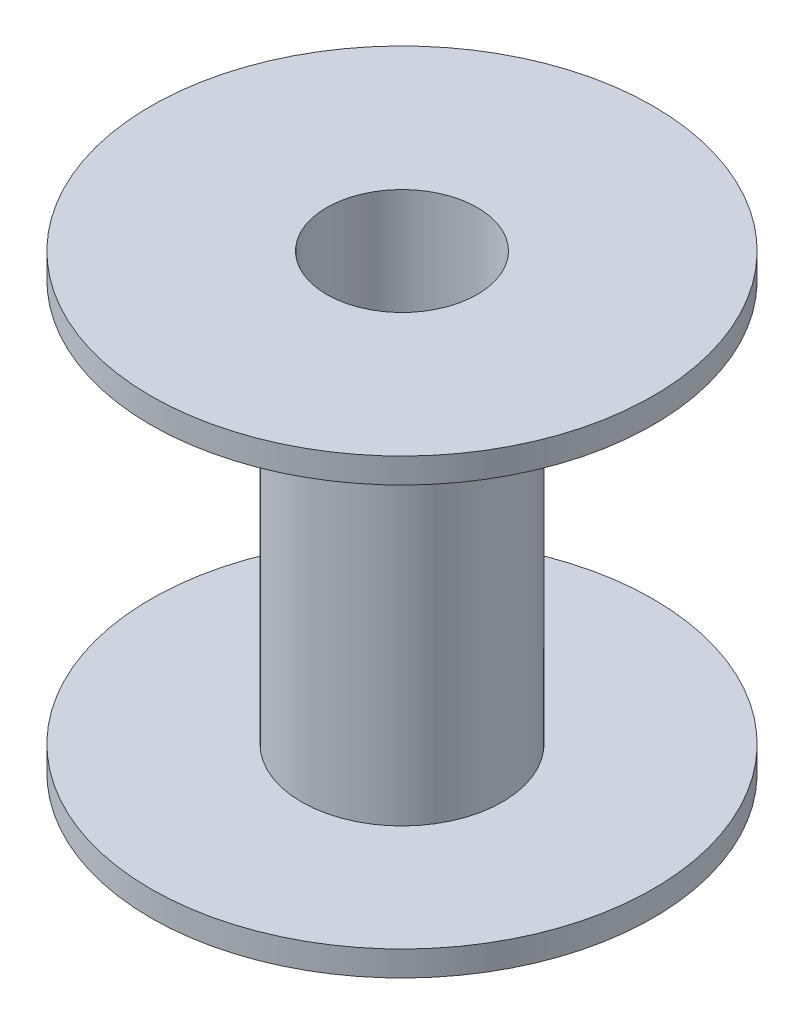
ISO-10303-21;
HEADER;
FILE_DESCRIPTION(('STEP AP214'),'2;1');
FILE_NAME('part.step','',(''),(''),'','','');
FILE_SCHEMA(('AUTOMOTIVE_DESIGN { 1 0 10303 214 1 1 1 1 }'));
ENDSEC;
DATA;
#1=APPLICATION_CONTEXT('core data for automotive mechanical design processes');
#2=APPLICATION_PROTOCOL_DEFINITION('international standard','automotive_design',2000,#1);
#3=PRODUCT_CONTEXT('',#1,'mechanical');
#4=PRODUCT('Part','Part','',(#3));
#5=PRODUCT_RELATED_PRODUCT_CATEGORY('part','',(#4));
#6=PRODUCT_DEFINITION_FORMATION('','',#4);
#7=PRODUCT_DEFINITION_CONTEXT('part definition',#1,'design');
#8=PRODUCT_DEFINITION('design','',#6,#7);
#9=PRODUCT_DEFINITION_SHAPE('','',#8);
#10=(LENGTH_UNIT() NAMED_UNIT(*) SI_UNIT(.MILLI.,.METRE.));
#11=(NAMED_UNIT(*) PLANE_ANGLE_UNIT() SI_UNIT($,.RADIAN.));
#12=(NAMED_UNIT(*) SI_UNIT($,.STERADIAN.) SOLID_ANGLE_UNIT());
#13=UNCERTAINTY_MEASURE_WITH_UNIT(LENGTH_MEASURE(1.E-05),#10,'distance_accuracy_value','');
#14=(GEOMETRIC_REPRESENTATION_CONTEXT(3) GLOBAL_UNCERTAINTY_ASSIGNED_CONTEXT((#13)) GLOBAL_UNIT_ASSIGNED_CONTEXT((#10,
#11,#12)) REPRESENTATION_CONTEXT('',''));
#15=CARTESIAN_POINT('',(0.,0.,0.));
#16=DIRECTION('',(0.,0.,1.));
#17=DIRECTION('',(1.,0.,0.));
#18=AXIS2_PLACEMENT_3D('',#15,#16,#17);
#19=CARTESIAN_POINT('',(0.,20.0281132974348,0.));
#20=DIRECTION('',(0.,1.,0.));
#21=DIRECTION('',(0.,0.,1.));
#22=AXIS2_PLACEMENT_3D('',#19,#20,#21);
#23=CYLINDRICAL_SURFACE('',#22,7.5);
#24=CARTESIAN_POINT('',(0.,1.5977529675946,0.));
#25=DIRECTION('',(0.,1.,0.));
#26=DIRECTION('',(0.,0.,1.));
#27=AXIS2_PLACEMENT_3D('',#24,#25,#26);
#28=CIRCLE('',#27,7.5);
#29=CARTESIAN_POINT('',(0.,1.5977529675946,7.5));
#30=VERTEX_POINT('',#29);
#31=EDGE_CURVE('E10',#30,#30,#28,.T.);
#32=ORIENTED_EDGE('',*,*,#31,.T.);
#33=EDGE_LOOP('',(#32));
#34=FACE_BOUND('',#33,.T.);
#35=CARTESIAN_POINT('',(0.,-43.4022470324054,0.));
#36=DIRECTION('',(0.,1.,0.));
#37=DIRECTION('',(0.,0.,1.));
#38=AXIS2_PLACEMENT_3D('',#35,#36,#37);
#39=CIRCLE('',#38,7.5);
#40=CARTESIAN_POINT('',(0.,-43.4022470324054,7.5));
#41=VERTEX_POINT('',#40);
#42=EDGE_CURVE('E63',#41,#41,#39,.T.);
#43=ORIENTED_EDGE('',*,*,#42,.F.);
#44=EDGE_LOOP('',(#43));
#45=FACE_BOUND('',#44,.T.);
#46=ADVANCED_FACE('F35',(#34,#45),#23,.F.);
#47=CARTESIAN_POINT('',(0.,1.5977529675946,7.5));
#48=DIRECTION('',(0.,1.,0.));
#49=DIRECTION('',(0.,0.,1.));
#50=AXIS2_PLACEMENT_3D('',#47,#48,#49);
#51=PLANE('',#50);
#52=CARTESIAN_POINT('',(0.,1.5977529675946,0.));
#53=DIRECTION('',(0.,1.,0.));
#54=DIRECTION('',(0.,0.,1.));
#55=AXIS2_PLACEMENT_3D('',#52,#53,#54);
#56=CIRCLE('',#55,25.);
#57=CARTESIAN_POINT('',(0.,1.5977529675946,25.));
#58=VERTEX_POINT('',#57);
#59=EDGE_CURVE('E41',#58,#58,#56,.T.);
#60=ORIENTED_EDGE('',*,*,#59,.T.);
#61=EDGE_LOOP('',(#60));
#62=FACE_BOUND('',#61,.T.);
#63=ORIENTED_EDGE('',*,*,#31,.F.);
#64=EDGE_LOOP('',(#63));
#65=FACE_BOUND('',#64,.T.);
#66=ADVANCED_FACE('F71',(#62,#65),#51,.T.);
#67=CARTESIAN_POINT('',(0.,20.0281132974348,0.));
#68=DIRECTION('',(0.,1.,0.));
#69=DIRECTION('',(0.,0.,1.));
#70=AXIS2_PLACEMENT_3D('',#67,#68,#69);
#71=CYLINDRICAL_SURFACE('',#70,25.);
#72=CARTESIAN_POINT('',(0.,-0.902247032405403,0.));
#73=DIRECTION('',(0.,1.,0.));
#74=DIRECTION('',(0.,0.,1.));
#75=AXIS2_PLACEMENT_3D('',#72,#73,#74);
#76=CIRCLE('',#75,25.);
#77=CARTESIAN_POINT('',(0.,-0.902247032405403,25.));
#78=VERTEX_POINT('',#77);
#79=EDGE_CURVE('E45',#78,#78,#76,.T.);
#80=ORIENTED_EDGE('',*,*,#79,.T.);
#81=EDGE_LOOP('',(#80));
#82=FACE_BOUND('',#81,.T.);
#83=ORIENTED_EDGE('',*,*,#59,.F.);
#84=EDGE_LOOP('',(#83));
#85=FACE_BOUND('',#84,.T.);
#86=ADVANCED_FACE('F75',(#82,#85),#71,.T.);
#87=CARTESIAN_POINT('',(0.,-0.902247032405401,25.));
#88=DIRECTION('',(0.,-1.,0.));
#89=DIRECTION('',(0.,0.,-1.));
#90=AXIS2_PLACEMENT_3D('',#87,#88,#89);
#91=PLANE('',#90);
#92=CARTESIAN_POINT('',(0.,-0.902247032405403,0.));
#93=DIRECTION('',(0.,1.,0.));
#94=DIRECTION('',(0.,0.,1.));
#95=AXIS2_PLACEMENT_3D('',#92,#93,#94);
#96=CIRCLE('',#95,10.);
#97=CARTESIAN_POINT('',(0.,-0.902247032405403,10.));
#98=VERTEX_POINT('',#97);
#99=EDGE_CURVE('E49',#98,#98,#96,.T.);
#100=ORIENTED_EDGE('',*,*,#99,.T.);
#101=EDGE_LOOP('',(#100));
#102=FACE_BOUND('',#101,.T.);
#103=ORIENTED_EDGE('',*,*,#79,.F.);
#104=EDGE_LOOP('',(#103));
#105=FACE_BOUND('',#104,.T.);
#106=ADVANCED_FACE('F79',(#102,#105),#91,.T.);
#107=CARTESIAN_POINT('',(0.,20.0281132974348,0.));
#108=DIRECTION('',(0.,1.,0.));
#109=DIRECTION('',(0.,0.,1.));
#110=AXIS2_PLACEMENT_3D('',#107,#108,#109);
#111=CYLINDRICAL_SURFACE('',#110,9.99999999999999);
#112=CARTESIAN_POINT('',(0.,-40.9022470324054,0.));
#113=DIRECTION('',(0.,1.,0.));
#114=DIRECTION('',(0.,0.,1.));
#115=AXIS2_PLACEMENT_3D('',#112,#113,#114);
#116=CIRCLE('',#115,9.99999999999999);
#117=CARTESIAN_POINT('',(0.,-40.9022470324054,9.99999999999999));
#118=VERTEX_POINT('',#117);
#119=EDGE_CURVE('E54',#118,#118,#116,.T.);
#120=ORIENTED_EDGE('',*,*,#119,.T.);
#121=EDGE_LOOP('',(#120));
#122=FACE_BOUND('',#121,.T.);
#123=ORIENTED_EDGE('',*,*,#99,.F.);
#124=EDGE_LOOP('',(#123));
#125=FACE_BOUND('',#124,.T.);
#126=ADVANCED_FACE('F86',(#122,#125),#111,.T.);
#127=CARTESIAN_POINT('',(0.,-40.9022470324054,9.99999999999999));
#128=DIRECTION('',(0.,1.,0.));
#129=DIRECTION('',(0.,0.,1.));
#130=AXIS2_PLACEMENT_3D('',#127,#128,#129);
#131=PLANE('',#130);
#132=CARTESIAN_POINT('',(0.,-40.9022470324054,0.));
#133=DIRECTION('',(0.,1.,0.));
#134=DIRECTION('',(0.,0.,1.));
#135=AXIS2_PLACEMENT_3D('',#132,#133,#134);
#136=CIRCLE('',#135,25.);
#137=CARTESIAN_POINT('',(0.,-40.9022470324054,25.));
#138=VERTEX_POINT('',#137);
#139=EDGE_CURVE('E57',#138,#138,#136,.T.);
#140=ORIENTED_EDGE('',*,*,#139,.T.);
#141=EDGE_LOOP('',(#140));
#142=FACE_BOUND('',#141,.T.);
#143=ORIENTED_EDGE('',*,*,#119,.F.);
#144=EDGE_LOOP('',(#143));
#145=FACE_BOUND('',#144,.T.);
#146=ADVANCED_FACE('F90',(#142,#145),#131,.T.);
#147=CARTESIAN_POINT('',(0.,20.0281132974348,0.));
#148=DIRECTION('',(0.,1.,0.));
#149=DIRECTION('',(0.,0.,1.));
#150=AXIS2_PLACEMENT_3D('',#147,#148,#149);
#151=CYLINDRICAL_SURFACE('',#150,25.);
#152=CARTESIAN_POINT('',(0.,-43.4022470324054,0.));
#153=DIRECTION('',(0.,1.,0.));
#154=DIRECTION('',(0.,0.,1.));
#155=AXIS2_PLACEMENT_3D('',#152,#153,#154);
#156=CIRCLE('',#155,25.);
#157=CARTESIAN_POINT('',(0.,-43.4022470324054,25.));
#158=VERTEX_POINT('',#157);
#159=EDGE_CURVE('E60',#158,#158,#156,.T.);
#160=ORIENTED_EDGE('',*,*,#159,.T.);
#161=EDGE_LOOP('',(#160));
#162=FACE_BOUND('',#161,.T.);
#163=ORIENTED_EDGE('',*,*,#139,.F.);
#164=EDGE_LOOP('',(#163));
#165=FACE_BOUND('',#164,.T.);
#166=ADVANCED_FACE('F94',(#162,#165),#151,.T.);
#167=CARTESIAN_POINT('',(0.,-43.4022470324054,25.));
#168=DIRECTION('',(0.,-1.,0.));
#169=DIRECTION('',(0.,0.,-1.));
#170=AXIS2_PLACEMENT_3D('',#167,#168,#169);
#171=PLANE('',#170);
#172=ORIENTED_EDGE('',*,*,#42,.T.);
#173=EDGE_LOOP('',(#172));
#174=FACE_BOUND('',#173,.T.);
#175=ORIENTED_EDGE('',*,*,#159,.F.);
#176=EDGE_LOOP('',(#175));
#177=FACE_BOUND('',#176,.T.);
#178=ADVANCED_FACE('F67',(#174,#177),#171,.T.);
#179=CLOSED_SHELL('',(#46,#66,#86,#106,#126,#146,#166,#178));
#180=MANIFOLD_SOLID_BREP('B2',#179);
#181=ADVANCED_BREP_SHAPE_REPRESENTATION('',(#18,#180),#14);
#182=SHAPE_DEFINITION_REPRESENTATION(#9,#181);
ENDSEC;
END-ISO-10303-21;
